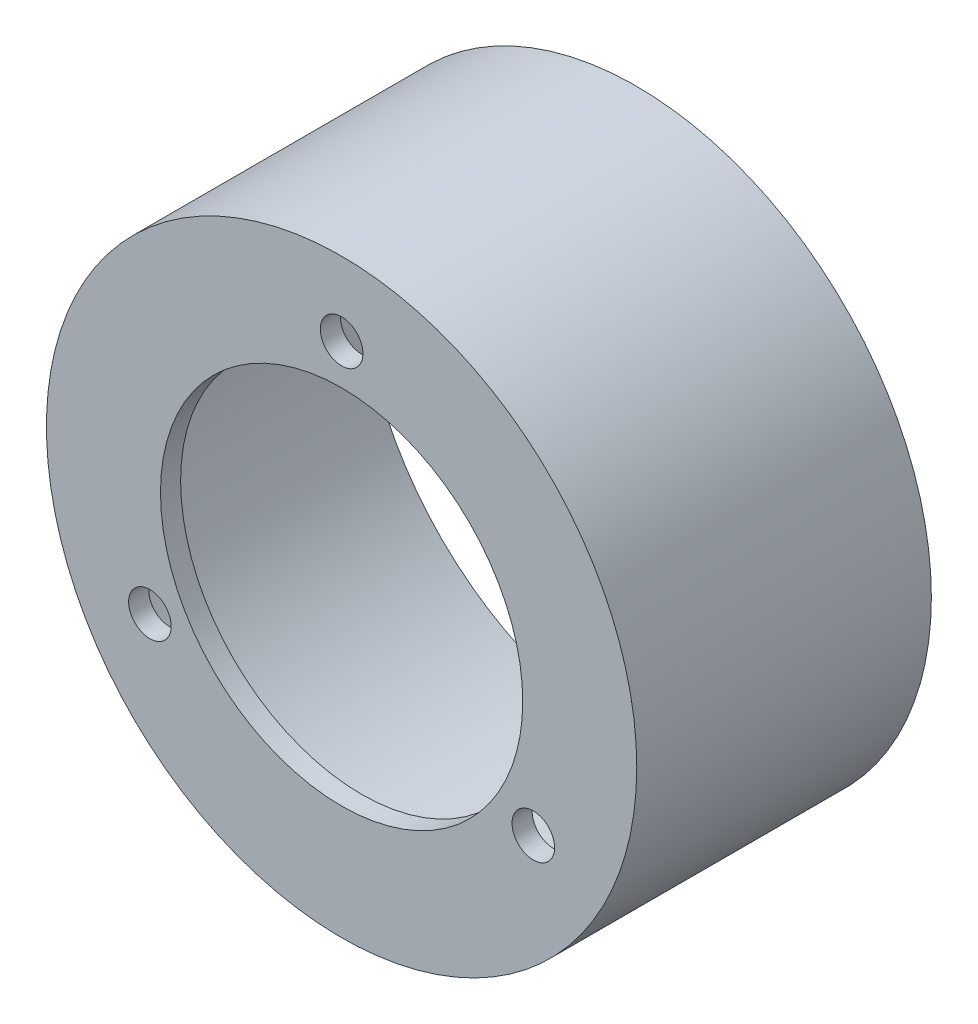
ISO-10303-21;
HEADER;
FILE_DESCRIPTION(('STEP AP214'),'2;1');
FILE_NAME('part.step','',(''),(''),'','','');
FILE_SCHEMA(('AUTOMOTIVE_DESIGN { 1 0 10303 214 1 1 1 1 }'));
ENDSEC;
DATA;
#1=APPLICATION_CONTEXT('core data for automotive mechanical design processes');
#2=APPLICATION_PROTOCOL_DEFINITION('international standard','automotive_design',2000,#1);
#3=PRODUCT_CONTEXT('',#1,'mechanical');
#4=PRODUCT('Part','Part','',(#3));
#5=PRODUCT_RELATED_PRODUCT_CATEGORY('part','',(#4));
#6=PRODUCT_DEFINITION_FORMATION('','',#4);
#7=PRODUCT_DEFINITION_CONTEXT('part definition',#1,'design');
#8=PRODUCT_DEFINITION('design','',#6,#7);
#9=PRODUCT_DEFINITION_SHAPE('','',#8);
#10=(LENGTH_UNIT() NAMED_UNIT(*) SI_UNIT(.MILLI.,.METRE.));
#11=(NAMED_UNIT(*) PLANE_ANGLE_UNIT() SI_UNIT($,.RADIAN.));
#12=(NAMED_UNIT(*) SI_UNIT($,.STERADIAN.) SOLID_ANGLE_UNIT());
#13=UNCERTAINTY_MEASURE_WITH_UNIT(LENGTH_MEASURE(1.E-05),#10,'distance_accuracy_value','');
#14=(GEOMETRIC_REPRESENTATION_CONTEXT(3) GLOBAL_UNCERTAINTY_ASSIGNED_CONTEXT((#13)) GLOBAL_UNIT_ASSIGNED_CONTEXT((#10,
#11,#12)) REPRESENTATION_CONTEXT('',''));
#15=CARTESIAN_POINT('',(0.,0.,0.));
#16=DIRECTION('',(0.,0.,1.));
#17=DIRECTION('',(1.,0.,0.));
#18=AXIS2_PLACEMENT_3D('',#15,#16,#17);
#19=CARTESIAN_POINT('',(0.,0.,1.5));
#20=DIRECTION('',(0.,0.,-1.));
#21=DIRECTION('',(-1.,0.,0.));
#22=AXIS2_PLACEMENT_3D('',#19,#20,#21);
#23=CYLINDRICAL_SURFACE('',#22,13.5);
#24=CARTESIAN_POINT('',(0.,0.,1.5));
#25=DIRECTION('',(0.,0.,1.));
#26=DIRECTION('',(1.,0.,0.));
#27=AXIS2_PLACEMENT_3D('',#24,#25,#26);
#28=CIRCLE('',#27,13.5);
#29=CARTESIAN_POINT('',(13.5,0.,1.5));
#30=VERTEX_POINT('',#29);
#31=EDGE_CURVE('E10',#30,#30,#28,.T.);
#32=ORIENTED_EDGE('',*,*,#31,.T.);
#33=EDGE_LOOP('',(#32));
#34=FACE_BOUND('',#33,.T.);
#35=CARTESIAN_POINT('',(0.,0.,0.));
#36=DIRECTION('',(0.,0.,1.));
#37=DIRECTION('',(1.,0.,0.));
#38=AXIS2_PLACEMENT_3D('',#35,#36,#37);
#39=CIRCLE('',#38,13.5);
#40=CARTESIAN_POINT('',(13.5,0.,0.));
#41=VERTEX_POINT('',#40);
#42=EDGE_CURVE('E60',#41,#41,#39,.T.);
#43=ORIENTED_EDGE('',*,*,#42,.F.);
#44=EDGE_LOOP('',(#43));
#45=FACE_BOUND('',#44,.T.);
#46=ADVANCED_FACE('F34',(#34,#45),#23,.F.);
#47=CARTESIAN_POINT('',(0.,16.5,1.5));
#48=DIRECTION('',(0.,0.,-1.));
#49=DIRECTION('',(-1.,0.,0.));
#50=AXIS2_PLACEMENT_3D('',#47,#48,#49);
#51=CYLINDRICAL_SURFACE('',#50,1.5875);
#52=CARTESIAN_POINT('',(0.,16.5,1.5));
#53=DIRECTION('',(0.,0.,1.));
#54=DIRECTION('',(1.,0.,0.));
#55=AXIS2_PLACEMENT_3D('',#52,#53,#54);
#56=CIRCLE('',#55,1.5875);
#57=CARTESIAN_POINT('',(1.5875,16.5,1.5));
#58=VERTEX_POINT('',#57);
#59=EDGE_CURVE('E42',#58,#58,#56,.T.);
#60=ORIENTED_EDGE('',*,*,#59,.T.);
#61=EDGE_LOOP('',(#60));
#62=FACE_BOUND('',#61,.T.);
#63=CARTESIAN_POINT('',(0.,16.5,0.));
#64=DIRECTION('',(0.,0.,1.));
#65=DIRECTION('',(1.,0.,0.));
#66=AXIS2_PLACEMENT_3D('',#63,#64,#65);
#67=CIRCLE('',#66,1.5875);
#68=CARTESIAN_POINT('',(1.5875,16.5,0.));
#69=VERTEX_POINT('',#68);
#70=EDGE_CURVE('E58',#69,#69,#67,.T.);
#71=ORIENTED_EDGE('',*,*,#70,.F.);
#72=EDGE_LOOP('',(#71));
#73=FACE_BOUND('',#72,.T.);
#74=ADVANCED_FACE('F102',(#62,#73),#51,.F.);
#75=CARTESIAN_POINT('',(14.2894191624432,-8.25,1.5));
#76=DIRECTION('',(0.,0.,-1.));
#77=DIRECTION('',(-1.,0.,0.));
#78=AXIS2_PLACEMENT_3D('',#75,#76,#77);
#79=CYLINDRICAL_SURFACE('',#78,1.5875);
#80=CARTESIAN_POINT('',(14.2894191624432,-8.25,1.5));
#81=DIRECTION('',(0.,0.,1.));
#82=DIRECTION('',(1.,0.,0.));
#83=AXIS2_PLACEMENT_3D('',#80,#81,#82);
#84=CIRCLE('',#83,1.5875);
#85=CARTESIAN_POINT('',(15.8769191624432,-8.25,1.5));
#86=VERTEX_POINT('',#85);
#87=EDGE_CURVE('E47',#86,#86,#84,.T.);
#88=ORIENTED_EDGE('',*,*,#87,.T.);
#89=EDGE_LOOP('',(#88));
#90=FACE_BOUND('',#89,.T.);
#91=CARTESIAN_POINT('',(14.2894191624432,-8.25,0.));
#92=DIRECTION('',(0.,0.,1.));
#93=DIRECTION('',(1.,0.,0.));
#94=AXIS2_PLACEMENT_3D('',#91,#92,#93);
#95=CIRCLE('',#94,1.5875);
#96=CARTESIAN_POINT('',(15.8769191624432,-8.25,0.));
#97=VERTEX_POINT('',#96);
#98=EDGE_CURVE('E54',#97,#97,#95,.T.);
#99=ORIENTED_EDGE('',*,*,#98,.F.);
#100=EDGE_LOOP('',(#99));
#101=FACE_BOUND('',#100,.T.);
#102=ADVANCED_FACE('F107',(#90,#101),#79,.F.);
#103=CARTESIAN_POINT('',(-14.2894191624432,-8.25,1.5));
#104=DIRECTION('',(0.,0.,-1.));
#105=DIRECTION('',(-1.,0.,0.));
#106=AXIS2_PLACEMENT_3D('',#103,#104,#105);
#107=CYLINDRICAL_SURFACE('',#106,1.5875);
#108=CARTESIAN_POINT('',(-14.2894191624432,-8.25,1.5));
#109=DIRECTION('',(0.,0.,1.));
#110=DIRECTION('',(1.,0.,0.));
#111=AXIS2_PLACEMENT_3D('',#108,#109,#110);
#112=CIRCLE('',#111,1.5875);
#113=CARTESIAN_POINT('',(-12.7019191624432,-8.25,1.5));
#114=VERTEX_POINT('',#113);
#115=EDGE_CURVE('E65',#114,#114,#112,.T.);
#116=ORIENTED_EDGE('',*,*,#115,.T.);
#117=EDGE_LOOP('',(#116));
#118=FACE_BOUND('',#117,.T.);
#119=CARTESIAN_POINT('',(-14.2894191624432,-8.25,0.));
#120=DIRECTION('',(0.,0.,1.));
#121=DIRECTION('',(1.,0.,0.));
#122=AXIS2_PLACEMENT_3D('',#119,#120,#121);
#123=CIRCLE('',#122,1.5875);
#124=CARTESIAN_POINT('',(-12.7019191624432,-8.25,0.));
#125=VERTEX_POINT('',#124);
#126=EDGE_CURVE('E51',#125,#125,#123,.T.);
#127=ORIENTED_EDGE('',*,*,#126,.F.);
#128=EDGE_LOOP('',(#127));
#129=FACE_BOUND('',#128,.T.);
#130=ADVANCED_FACE('F36',(#118,#129),#107,.F.);
#131=CARTESIAN_POINT('',(0.,-45.2414213562373,1.5));
#132=DIRECTION('',(0.,0.,1.));
#133=DIRECTION('',(1.,0.,0.));
#134=AXIS2_PLACEMENT_3D('',#131,#132,#133);
#135=PLANE('',#134);
#136=ORIENTED_EDGE('',*,*,#115,.F.);
#137=EDGE_LOOP('',(#136));
#138=FACE_BOUND('',#137,.T.);
#139=ORIENTED_EDGE('',*,*,#87,.F.);
#140=EDGE_LOOP('',(#139));
#141=FACE_BOUND('',#140,.T.);
#142=ORIENTED_EDGE('',*,*,#59,.F.);
#143=EDGE_LOOP('',(#142));
#144=FACE_BOUND('',#143,.T.);
#145=ORIENTED_EDGE('',*,*,#31,.F.);
#146=EDGE_LOOP('',(#145));
#147=FACE_BOUND('',#146,.T.);
#148=CARTESIAN_POINT('',(0.,0.,1.5));
#149=DIRECTION('',(0.,0.,1.));
#150=DIRECTION('',(1.,0.,0.));
#151=AXIS2_PLACEMENT_3D('',#148,#149,#150);
#152=CIRCLE('',#151,22.);
#153=CARTESIAN_POINT('',(22.,0.,1.5));
#154=VERTEX_POINT('',#153);
#155=EDGE_CURVE('E74',#154,#154,#152,.T.);
#156=ORIENTED_EDGE('',*,*,#155,.T.);
#157=EDGE_LOOP('',(#156));
#158=FACE_BOUND('',#157,.T.);
#159=ADVANCED_FACE('F97',(#138,#141,#144,#147,#158),#135,.T.);
#160=CARTESIAN_POINT('',(0.,-45.2414213562373,0.));
#161=DIRECTION('',(0.,0.,1.));
#162=DIRECTION('',(1.,0.,0.));
#163=AXIS2_PLACEMENT_3D('',#160,#161,#162);
#164=PLANE('',#163);
#165=ORIENTED_EDGE('',*,*,#126,.T.);
#166=EDGE_LOOP('',(#165));
#167=FACE_BOUND('',#166,.T.);
#168=ORIENTED_EDGE('',*,*,#98,.T.);
#169=EDGE_LOOP('',(#168));
#170=FACE_BOUND('',#169,.T.);
#171=ORIENTED_EDGE('',*,*,#70,.T.);
#172=EDGE_LOOP('',(#171));
#173=FACE_BOUND('',#172,.T.);
#174=ORIENTED_EDGE('',*,*,#42,.T.);
#175=EDGE_LOOP('',(#174));
#176=FACE_BOUND('',#175,.T.);
#177=CARTESIAN_POINT('',(0.,0.,0.));
#178=DIRECTION('',(0.,0.,1.));
#179=DIRECTION('',(1.,0.,0.));
#180=AXIS2_PLACEMENT_3D('',#177,#178,#179);
#181=CIRCLE('',#180,20.5);
#182=CARTESIAN_POINT('',(20.5,0.,0.));
#183=VERTEX_POINT('',#182);
#184=EDGE_CURVE('E38',#183,#183,#181,.T.);
#185=ORIENTED_EDGE('',*,*,#184,.F.);
#186=EDGE_LOOP('',(#185));
#187=FACE_BOUND('',#186,.T.);
#188=ADVANCED_FACE('F89',(#167,#170,#173,#176,#187),#164,.F.);
#189=CARTESIAN_POINT('',(0.,0.,-20.4577));
#190=DIRECTION('',(0.,0.,1.));
#191=DIRECTION('',(1.,0.,0.));
#192=AXIS2_PLACEMENT_3D('',#189,#190,#191);
#193=CYLINDRICAL_SURFACE('',#192,20.5);
#194=CARTESIAN_POINT('',(0.,0.,-20.4577));
#195=DIRECTION('',(0.,0.,1.));
#196=DIRECTION('',(1.,0.,0.));
#197=AXIS2_PLACEMENT_3D('',#194,#195,#196);
#198=CIRCLE('',#197,20.5);
#199=CARTESIAN_POINT('',(20.5,0.,-20.4577));
#200=VERTEX_POINT('',#199);
#201=EDGE_CURVE('E77',#200,#200,#198,.T.);
#202=ORIENTED_EDGE('',*,*,#201,.F.);
#203=EDGE_LOOP('',(#202));
#204=FACE_BOUND('',#203,.T.);
#205=ORIENTED_EDGE('',*,*,#184,.T.);
#206=EDGE_LOOP('',(#205));
#207=FACE_BOUND('',#206,.T.);
#208=ADVANCED_FACE('F86',(#204,#207),#193,.F.);
#209=CARTESIAN_POINT('',(0.,0.,-20.4577));
#210=DIRECTION('',(0.,0.,1.));
#211=DIRECTION('',(1.,0.,0.));
#212=AXIS2_PLACEMENT_3D('',#209,#210,#211);
#213=CYLINDRICAL_SURFACE('',#212,22.);
#214=CARTESIAN_POINT('',(0.,0.,-20.4577));
#215=DIRECTION('',(0.,0.,1.));
#216=DIRECTION('',(1.,0.,0.));
#217=AXIS2_PLACEMENT_3D('',#214,#215,#216);
#218=CIRCLE('',#217,22.);
#219=CARTESIAN_POINT('',(22.,0.,-20.4577));
#220=VERTEX_POINT('',#219);
#221=EDGE_CURVE('E55',#220,#220,#218,.T.);
#222=ORIENTED_EDGE('',*,*,#221,.T.);
#223=EDGE_LOOP('',(#222));
#224=FACE_BOUND('',#223,.T.);
#225=ORIENTED_EDGE('',*,*,#155,.F.);
#226=EDGE_LOOP('',(#225));
#227=FACE_BOUND('',#226,.T.);
#228=ADVANCED_FACE('F88',(#224,#227),#213,.T.);
#229=CARTESIAN_POINT('',(0.,-48.5414213562373,-20.4577));
#230=DIRECTION('',(0.,0.,1.));
#231=DIRECTION('',(1.,0.,0.));
#232=AXIS2_PLACEMENT_3D('',#229,#230,#231);
#233=PLANE('',#232);
#234=ORIENTED_EDGE('',*,*,#201,.T.);
#235=EDGE_LOOP('',(#234));
#236=FACE_BOUND('',#235,.T.);
#237=ORIENTED_EDGE('',*,*,#221,.F.);
#238=EDGE_LOOP('',(#237));
#239=FACE_BOUND('',#238,.T.);
#240=ADVANCED_FACE('F83',(#236,#239),#233,.F.);
#241=CLOSED_SHELL('',(#46,#74,#102,#130,#159,#188,#208,#228,#240));
#242=MANIFOLD_SOLID_BREP('B2',#241);
#243=ADVANCED_BREP_SHAPE_REPRESENTATION('',(#18,#242),#14);
#244=SHAPE_DEFINITION_REPRESENTATION(#9,#243);
ENDSEC;
END-ISO-10303-21;
